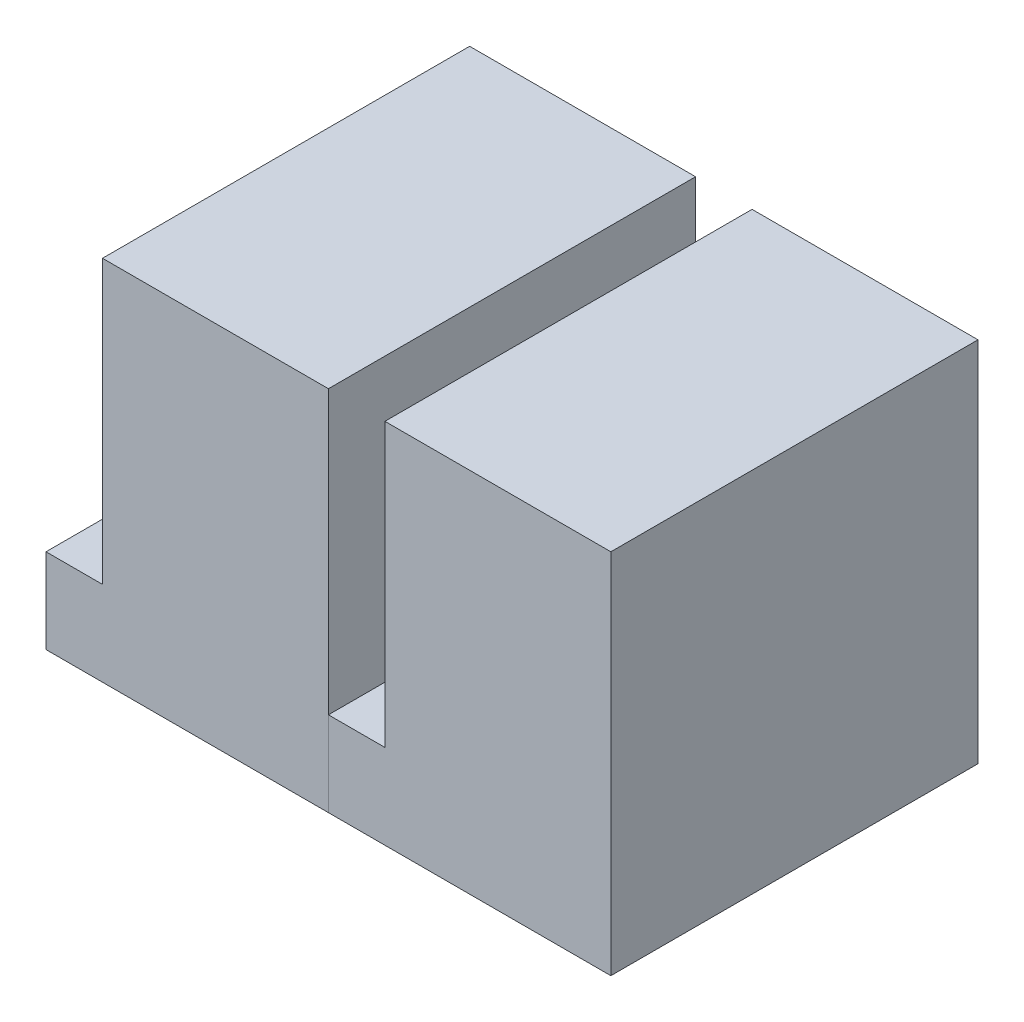
ISO-10303-21;
HEADER;
FILE_DESCRIPTION(('STEP AP214'),'2;1');
FILE_NAME('part.step','',(''),(''),'','','');
FILE_SCHEMA(('AUTOMOTIVE_DESIGN { 1 0 10303 214 1 1 1 1 }'));
ENDSEC;
DATA;
#1=APPLICATION_CONTEXT('core data for automotive mechanical design processes');
#2=APPLICATION_PROTOCOL_DEFINITION('international standard','automotive_design',2000,#1);
#3=PRODUCT_CONTEXT('',#1,'mechanical');
#4=PRODUCT('Part','Part','',(#3));
#5=PRODUCT_RELATED_PRODUCT_CATEGORY('part','',(#4));
#6=PRODUCT_DEFINITION_FORMATION('','',#4);
#7=PRODUCT_DEFINITION_CONTEXT('part definition',#1,'design');
#8=PRODUCT_DEFINITION('design','',#6,#7);
#9=PRODUCT_DEFINITION_SHAPE('','',#8);
#10=(LENGTH_UNIT() NAMED_UNIT(*) SI_UNIT(.MILLI.,.METRE.));
#11=(NAMED_UNIT(*) PLANE_ANGLE_UNIT() SI_UNIT($,.RADIAN.));
#12=(NAMED_UNIT(*) SI_UNIT($,.STERADIAN.) SOLID_ANGLE_UNIT());
#13=UNCERTAINTY_MEASURE_WITH_UNIT(LENGTH_MEASURE(1.E-05),#10,'distance_accuracy_value','');
#14=(GEOMETRIC_REPRESENTATION_CONTEXT(3) GLOBAL_UNCERTAINTY_ASSIGNED_CONTEXT((#13)) GLOBAL_UNIT_ASSIGNED_CONTEXT((#10,
#11,#12)) REPRESENTATION_CONTEXT('',''));
#15=CARTESIAN_POINT('',(0.,0.,0.));
#16=DIRECTION('',(0.,0.,1.));
#17=DIRECTION('',(1.,0.,0.));
#18=AXIS2_PLACEMENT_3D('',#15,#16,#17);
#19=CARTESIAN_POINT('',(-10.,13.,0.));
#20=DIRECTION('',(1.,0.,0.));
#21=DIRECTION('',(0.,0.,-1.));
#22=AXIS2_PLACEMENT_3D('',#19,#20,#21);
#23=PLANE('',#22);
#24=DIRECTION('',(0.,0.,-1.));
#25=VECTOR('',#24,1.);
#26=CARTESIAN_POINT('',(-10.,3.,-13.));
#27=LINE('',#26,#25);
#28=CARTESIAN_POINT('',(-10.,3.,0.));
#29=VERTEX_POINT('',#28);
#30=CARTESIAN_POINT('',(-10.,3.,-13.));
#31=VERTEX_POINT('',#30);
#32=EDGE_CURVE('E65',#29,#31,#27,.T.);
#33=ORIENTED_EDGE('',*,*,#32,.F.);
#34=DIRECTION('',(0.,-1.,0.));
#35=VECTOR('',#34,1.);
#36=CARTESIAN_POINT('',(-10.,13.,0.));
#37=LINE('',#36,#35);
#38=CARTESIAN_POINT('',(-10.,13.,0.));
#39=VERTEX_POINT('',#38);
#40=EDGE_CURVE('E12',#39,#29,#37,.T.);
#41=ORIENTED_EDGE('',*,*,#40,.F.);
#42=DIRECTION('',(0.,0.,1.));
#43=VECTOR('',#42,1.);
#44=CARTESIAN_POINT('',(-10.,13.,0.));
#45=LINE('',#44,#43);
#46=CARTESIAN_POINT('',(-10.,13.,-13.));
#47=VERTEX_POINT('',#46);
#48=EDGE_CURVE('E139',#47,#39,#45,.T.);
#49=ORIENTED_EDGE('',*,*,#48,.F.);
#50=DIRECTION('',(0.,-1.,0.));
#51=VECTOR('',#50,1.);
#52=CARTESIAN_POINT('',(-10.,13.,-13.));
#53=LINE('',#52,#51);
#54=EDGE_CURVE('E202',#47,#31,#53,.T.);
#55=ORIENTED_EDGE('',*,*,#54,.T.);
#56=EDGE_LOOP('',(#33,#41,#49,#55));
#57=FACE_BOUND('',#56,.T.);
#58=ADVANCED_FACE('F51',(#57),#23,.F.);
#59=CARTESIAN_POINT('',(-10.,13.,0.));
#60=DIRECTION('',(0.,0.,-1.));
#61=DIRECTION('',(-1.,0.,0.));
#62=AXIS2_PLACEMENT_3D('',#59,#60,#61);
#63=PLANE('',#62);
#64=DIRECTION('',(1.,0.,0.));
#65=VECTOR('',#64,1.);
#66=CARTESIAN_POINT('',(-10.,0.,0.));
#67=LINE('',#66,#65);
#68=CARTESIAN_POINT('',(-12.,0.,0.));
#69=VERTEX_POINT('',#68);
#70=CARTESIAN_POINT('',(-2.,0.,0.));
#71=VERTEX_POINT('',#70);
#72=EDGE_CURVE('E145',#69,#71,#67,.T.);
#73=ORIENTED_EDGE('',*,*,#72,.T.);
#74=DIRECTION('',(0.,-1.,0.));
#75=VECTOR('',#74,1.);
#76=CARTESIAN_POINT('',(-2.,13.,0.));
#77=LINE('',#76,#75);
#78=CARTESIAN_POINT('',(-2.,13.,0.));
#79=VERTEX_POINT('',#78);
#80=EDGE_CURVE('E58',#79,#71,#77,.T.);
#81=ORIENTED_EDGE('',*,*,#80,.F.);
#82=DIRECTION('',(1.,0.,0.));
#83=VECTOR('',#82,1.);
#84=CARTESIAN_POINT('',(-10.,13.,0.));
#85=LINE('',#84,#83);
#86=EDGE_CURVE('E196',#39,#79,#85,.T.);
#87=ORIENTED_EDGE('',*,*,#86,.F.);
#88=ORIENTED_EDGE('',*,*,#40,.T.);
#89=DIRECTION('',(1.,0.,0.));
#90=VECTOR('',#89,1.);
#91=CARTESIAN_POINT('',(-12.,3.,0.));
#92=LINE('',#91,#90);
#93=CARTESIAN_POINT('',(-12.,3.,0.));
#94=VERTEX_POINT('',#93);
#95=EDGE_CURVE('E161',#94,#29,#92,.T.);
#96=ORIENTED_EDGE('',*,*,#95,.F.);
#97=DIRECTION('',(0.,1.,0.));
#98=VECTOR('',#97,1.);
#99=CARTESIAN_POINT('',(-12.,0.,0.));
#100=LINE('',#99,#98);
#101=EDGE_CURVE('E148',#69,#94,#100,.T.);
#102=ORIENTED_EDGE('',*,*,#101,.F.);
#103=EDGE_LOOP('',(#73,#81,#87,#88,#96,#102));
#104=FACE_BOUND('',#103,.T.);
#105=ADVANCED_FACE('F212',(#104),#63,.F.);
#106=CARTESIAN_POINT('',(-2.,13.,0.));
#107=DIRECTION('',(-1.,0.,0.));
#108=DIRECTION('',(0.,0.,1.));
#109=AXIS2_PLACEMENT_3D('',#106,#107,#108);
#110=PLANE('',#109);
#111=DIRECTION('',(0.,0.,-1.));
#112=VECTOR('',#111,1.);
#113=CARTESIAN_POINT('',(-2.,0.,0.));
#114=LINE('',#113,#112);
#115=CARTESIAN_POINT('',(-2.,0.,-13.));
#116=VERTEX_POINT('',#115);
#117=EDGE_CURVE('E140',#71,#116,#114,.T.);
#118=ORIENTED_EDGE('',*,*,#117,.T.);
#119=DIRECTION('',(0.,-1.,0.));
#120=VECTOR('',#119,1.);
#121=CARTESIAN_POINT('',(-2.,13.,-13.));
#122=LINE('',#121,#120);
#123=CARTESIAN_POINT('',(-2.,13.,-13.));
#124=VERTEX_POINT('',#123);
#125=EDGE_CURVE('E136',#124,#116,#122,.T.);
#126=ORIENTED_EDGE('',*,*,#125,.F.);
#127=DIRECTION('',(0.,0.,-1.));
#128=VECTOR('',#127,1.);
#129=CARTESIAN_POINT('',(-2.,13.,0.));
#130=LINE('',#129,#128);
#131=EDGE_CURVE('E198',#79,#124,#130,.T.);
#132=ORIENTED_EDGE('',*,*,#131,.F.);
#133=ORIENTED_EDGE('',*,*,#80,.T.);
#134=EDGE_LOOP('',(#118,#126,#132,#133));
#135=FACE_BOUND('',#134,.T.);
#136=ADVANCED_FACE('F210',(#135),#110,.F.);
#137=CARTESIAN_POINT('',(-10.,13.,-13.));
#138=DIRECTION('',(0.,0.,1.));
#139=DIRECTION('',(1.,0.,0.));
#140=AXIS2_PLACEMENT_3D('',#137,#138,#139);
#141=PLANE('',#140);
#142=DIRECTION('',(-1.,0.,0.));
#143=VECTOR('',#142,1.);
#144=CARTESIAN_POINT('',(-10.,0.,-13.));
#145=LINE('',#144,#143);
#146=CARTESIAN_POINT('',(-12.,0.,-13.));
#147=VERTEX_POINT('',#146);
#148=EDGE_CURVE('E128',#116,#147,#145,.T.);
#149=ORIENTED_EDGE('',*,*,#148,.T.);
#150=DIRECTION('',(0.,-1.,0.));
#151=VECTOR('',#150,1.);
#152=CARTESIAN_POINT('',(-12.,0.,-13.));
#153=LINE('',#152,#151);
#154=CARTESIAN_POINT('',(-12.,3.,-13.));
#155=VERTEX_POINT('',#154);
#156=EDGE_CURVE('E133',#155,#147,#153,.T.);
#157=ORIENTED_EDGE('',*,*,#156,.F.);
#158=DIRECTION('',(1.,0.,0.));
#159=VECTOR('',#158,1.);
#160=CARTESIAN_POINT('',(-12.,3.,-13.));
#161=LINE('',#160,#159);
#162=EDGE_CURVE('E158',#155,#31,#161,.T.);
#163=ORIENTED_EDGE('',*,*,#162,.T.);
#164=ORIENTED_EDGE('',*,*,#54,.F.);
#165=DIRECTION('',(-1.,0.,0.));
#166=VECTOR('',#165,1.);
#167=CARTESIAN_POINT('',(-10.,13.,-13.));
#168=LINE('',#167,#166);
#169=EDGE_CURVE('E200',#124,#47,#168,.T.);
#170=ORIENTED_EDGE('',*,*,#169,.F.);
#171=ORIENTED_EDGE('',*,*,#125,.T.);
#172=EDGE_LOOP('',(#149,#157,#163,#164,#170,#171));
#173=FACE_BOUND('',#172,.T.);
#174=ADVANCED_FACE('F130',(#173),#141,.F.);
#175=CARTESIAN_POINT('',(-10.,13.,0.));
#176=DIRECTION('',(0.,-1.,0.));
#177=DIRECTION('',(0.,0.,-1.));
#178=AXIS2_PLACEMENT_3D('',#175,#176,#177);
#179=PLANE('',#178);
#180=ORIENTED_EDGE('',*,*,#48,.T.);
#181=ORIENTED_EDGE('',*,*,#86,.T.);
#182=ORIENTED_EDGE('',*,*,#131,.T.);
#183=ORIENTED_EDGE('',*,*,#169,.T.);
#184=EDGE_LOOP('',(#180,#181,#182,#183));
#185=FACE_BOUND('',#184,.T.);
#186=ADVANCED_FACE('F219',(#185),#179,.F.);
#187=CARTESIAN_POINT('',(-10.,0.,0.));
#188=DIRECTION('',(0.,-1.,0.));
#189=DIRECTION('',(0.,0.,-1.));
#190=AXIS2_PLACEMENT_3D('',#187,#188,#189);
#191=PLANE('',#190);
#192=DIRECTION('',(0.,0.,-1.));
#193=VECTOR('',#192,1.);
#194=CARTESIAN_POINT('',(-9.,0.,-1.));
#195=LINE('',#194,#193);
#196=CARTESIAN_POINT('',(-9.,0.,-1.));
#197=VERTEX_POINT('',#196);
#198=CARTESIAN_POINT('',(-9.,0.,-12.));
#199=VERTEX_POINT('',#198);
#200=EDGE_CURVE('E72',#197,#199,#195,.T.);
#201=ORIENTED_EDGE('',*,*,#200,.F.);
#202=DIRECTION('',(-1.,0.,0.));
#203=VECTOR('',#202,1.);
#204=CARTESIAN_POINT('',(-9.,0.,-1.));
#205=LINE('',#204,#203);
#206=CARTESIAN_POINT('',(-3.,0.,-1.));
#207=VERTEX_POINT('',#206);
#208=EDGE_CURVE('E168',#207,#197,#205,.T.);
#209=ORIENTED_EDGE('',*,*,#208,.F.);
#210=DIRECTION('',(0.,0.,1.));
#211=VECTOR('',#210,1.);
#212=CARTESIAN_POINT('',(-3.,0.,-1.));
#213=LINE('',#212,#211);
#214=CARTESIAN_POINT('',(-3.,0.,-12.));
#215=VERTEX_POINT('',#214);
#216=EDGE_CURVE('E182',#215,#207,#213,.T.);
#217=ORIENTED_EDGE('',*,*,#216,.F.);
#218=DIRECTION('',(1.,0.,0.));
#219=VECTOR('',#218,1.);
#220=CARTESIAN_POINT('',(-9.,0.,-12.));
#221=LINE('',#220,#219);
#222=EDGE_CURVE('E179',#199,#215,#221,.T.);
#223=ORIENTED_EDGE('',*,*,#222,.F.);
#224=EDGE_LOOP('',(#201,#209,#217,#223));
#225=FACE_BOUND('',#224,.T.);
#226=ORIENTED_EDGE('',*,*,#72,.F.);
#227=DIRECTION('',(0.,0.,1.));
#228=VECTOR('',#227,1.);
#229=CARTESIAN_POINT('',(-12.,0.,-13.));
#230=LINE('',#229,#228);
#231=EDGE_CURVE('E143',#147,#69,#230,.T.);
#232=ORIENTED_EDGE('',*,*,#231,.F.);
#233=ORIENTED_EDGE('',*,*,#148,.F.);
#234=ORIENTED_EDGE('',*,*,#117,.F.);
#235=EDGE_LOOP('',(#226,#232,#233,#234));
#236=FACE_BOUND('',#235,.T.);
#237=ADVANCED_FACE('F144',(#225,#236),#191,.T.);
#238=CARTESIAN_POINT('',(-9.,12.,-1.));
#239=DIRECTION('',(-1.,0.,0.));
#240=DIRECTION('',(0.,0.,1.));
#241=AXIS2_PLACEMENT_3D('',#238,#239,#240);
#242=PLANE('',#241);
#243=ORIENTED_EDGE('',*,*,#200,.T.);
#244=DIRECTION('',(0.,-1.,0.));
#245=VECTOR('',#244,1.);
#246=CARTESIAN_POINT('',(-9.,12.,-12.));
#247=LINE('',#246,#245);
#248=CARTESIAN_POINT('',(-9.,12.,-12.));
#249=VERTEX_POINT('',#248);
#250=EDGE_CURVE('E177',#249,#199,#247,.T.);
#251=ORIENTED_EDGE('',*,*,#250,.F.);
#252=DIRECTION('',(0.,0.,-1.));
#253=VECTOR('',#252,1.);
#254=CARTESIAN_POINT('',(-9.,12.,-1.));
#255=LINE('',#254,#253);
#256=CARTESIAN_POINT('',(-9.,12.,-1.));
#257=VERTEX_POINT('',#256);
#258=EDGE_CURVE('E164',#257,#249,#255,.T.);
#259=ORIENTED_EDGE('',*,*,#258,.F.);
#260=DIRECTION('',(0.,-1.,0.));
#261=VECTOR('',#260,1.);
#262=CARTESIAN_POINT('',(-9.,12.,-1.));
#263=LINE('',#262,#261);
#264=EDGE_CURVE('E187',#257,#197,#263,.T.);
#265=ORIENTED_EDGE('',*,*,#264,.T.);
#266=EDGE_LOOP('',(#243,#251,#259,#265));
#267=FACE_BOUND('',#266,.T.);
#268=ADVANCED_FACE('F226',(#267),#242,.F.);
#269=CARTESIAN_POINT('',(-9.,12.,-1.));
#270=DIRECTION('',(0.,0.,1.));
#271=DIRECTION('',(1.,0.,0.));
#272=AXIS2_PLACEMENT_3D('',#269,#270,#271);
#273=PLANE('',#272);
#274=ORIENTED_EDGE('',*,*,#208,.T.);
#275=ORIENTED_EDGE('',*,*,#264,.F.);
#276=DIRECTION('',(-1.,0.,0.));
#277=VECTOR('',#276,1.);
#278=CARTESIAN_POINT('',(-9.,12.,-1.));
#279=LINE('',#278,#277);
#280=CARTESIAN_POINT('',(-3.,12.,-1.));
#281=VERTEX_POINT('',#280);
#282=EDGE_CURVE('E174',#281,#257,#279,.T.);
#283=ORIENTED_EDGE('',*,*,#282,.F.);
#284=DIRECTION('',(0.,-1.,0.));
#285=VECTOR('',#284,1.);
#286=CARTESIAN_POINT('',(-3.,12.,-1.));
#287=LINE('',#286,#285);
#288=EDGE_CURVE('E189',#281,#207,#287,.T.);
#289=ORIENTED_EDGE('',*,*,#288,.T.);
#290=EDGE_LOOP('',(#274,#275,#283,#289));
#291=FACE_BOUND('',#290,.T.);
#292=ADVANCED_FACE('F266',(#291),#273,.F.);
#293=CARTESIAN_POINT('',(-3.,12.,-1.));
#294=DIRECTION('',(1.,0.,0.));
#295=DIRECTION('',(0.,0.,-1.));
#296=AXIS2_PLACEMENT_3D('',#293,#294,#295);
#297=PLANE('',#296);
#298=ORIENTED_EDGE('',*,*,#216,.T.);
#299=ORIENTED_EDGE('',*,*,#288,.F.);
#300=DIRECTION('',(0.,0.,1.));
#301=VECTOR('',#300,1.);
#302=CARTESIAN_POINT('',(-3.,12.,-1.));
#303=LINE('',#302,#301);
#304=CARTESIAN_POINT('',(-3.,12.,-12.));
#305=VERTEX_POINT('',#304);
#306=EDGE_CURVE('E171',#305,#281,#303,.T.);
#307=ORIENTED_EDGE('',*,*,#306,.F.);
#308=DIRECTION('',(0.,-1.,0.));
#309=VECTOR('',#308,1.);
#310=CARTESIAN_POINT('',(-3.,12.,-12.));
#311=LINE('',#310,#309);
#312=EDGE_CURVE('E191',#305,#215,#311,.T.);
#313=ORIENTED_EDGE('',*,*,#312,.T.);
#314=EDGE_LOOP('',(#298,#299,#307,#313));
#315=FACE_BOUND('',#314,.T.);
#316=ADVANCED_FACE('F274',(#315),#297,.F.);
#317=CARTESIAN_POINT('',(-9.,12.,-12.));
#318=DIRECTION('',(0.,0.,-1.));
#319=DIRECTION('',(-1.,0.,0.));
#320=AXIS2_PLACEMENT_3D('',#317,#318,#319);
#321=PLANE('',#320);
#322=ORIENTED_EDGE('',*,*,#222,.T.);
#323=ORIENTED_EDGE('',*,*,#312,.F.);
#324=DIRECTION('',(1.,0.,0.));
#325=VECTOR('',#324,1.);
#326=CARTESIAN_POINT('',(-9.,12.,-12.));
#327=LINE('',#326,#325);
#328=EDGE_CURVE('E167',#249,#305,#327,.T.);
#329=ORIENTED_EDGE('',*,*,#328,.F.);
#330=ORIENTED_EDGE('',*,*,#250,.T.);
#331=EDGE_LOOP('',(#322,#323,#329,#330));
#332=FACE_BOUND('',#331,.T.);
#333=ADVANCED_FACE('F284',(#332),#321,.F.);
#334=CARTESIAN_POINT('',(-10.,12.,0.));
#335=DIRECTION('',(0.,-1.,0.));
#336=DIRECTION('',(0.,0.,-1.));
#337=AXIS2_PLACEMENT_3D('',#334,#335,#336);
#338=PLANE('',#337);
#339=ORIENTED_EDGE('',*,*,#258,.T.);
#340=ORIENTED_EDGE('',*,*,#328,.T.);
#341=ORIENTED_EDGE('',*,*,#306,.T.);
#342=ORIENTED_EDGE('',*,*,#282,.T.);
#343=EDGE_LOOP('',(#339,#340,#341,#342));
#344=FACE_BOUND('',#343,.T.);
#345=ADVANCED_FACE('F294',(#344),#338,.T.);
#346=CARTESIAN_POINT('',(-12.,3.,-13.));
#347=DIRECTION('',(0.,-1.,0.));
#348=DIRECTION('',(0.,0.,-1.));
#349=AXIS2_PLACEMENT_3D('',#346,#347,#348);
#350=PLANE('',#349);
#351=ORIENTED_EDGE('',*,*,#32,.T.);
#352=ORIENTED_EDGE('',*,*,#162,.F.);
#353=DIRECTION('',(0.,0.,-1.));
#354=VECTOR('',#353,1.);
#355=CARTESIAN_POINT('',(-12.,3.,-13.));
#356=LINE('',#355,#354);
#357=EDGE_CURVE('E152',#94,#155,#356,.T.);
#358=ORIENTED_EDGE('',*,*,#357,.F.);
#359=ORIENTED_EDGE('',*,*,#95,.T.);
#360=EDGE_LOOP('',(#351,#352,#358,#359));
#361=FACE_BOUND('',#360,.T.);
#362=ADVANCED_FACE('F215',(#361),#350,.F.);
#363=CARTESIAN_POINT('',(-12.,0.,0.));
#364=DIRECTION('',(1.,0.,0.));
#365=DIRECTION('',(0.,0.,-1.));
#366=AXIS2_PLACEMENT_3D('',#363,#364,#365);
#367=PLANE('',#366);
#368=ORIENTED_EDGE('',*,*,#156,.T.);
#369=ORIENTED_EDGE('',*,*,#231,.T.);
#370=ORIENTED_EDGE('',*,*,#101,.T.);
#371=ORIENTED_EDGE('',*,*,#357,.T.);
#372=EDGE_LOOP('',(#368,#369,#370,#371));
#373=FACE_BOUND('',#372,.T.);
#374=ADVANCED_FACE('F150',(#373),#367,.F.);
#375=CLOSED_SHELL('',(#58,#105,#136,#174,#186,#237,#268,#292,#316,#333,#345,#362,#374));
#376=MANIFOLD_SOLID_BREP('B2',#375);
#377=CARTESIAN_POINT('',(0.,13.,0.));
#378=DIRECTION('',(1.,0.,0.));
#379=DIRECTION('',(0.,0.,-1.));
#380=AXIS2_PLACEMENT_3D('',#377,#378,#379);
#381=PLANE('',#380);
#382=DIRECTION('',(0.,0.,-1.));
#383=VECTOR('',#382,1.);
#384=CARTESIAN_POINT('',(0.,3.,-13.));
#385=LINE('',#384,#383);
#386=CARTESIAN_POINT('',(0.,3.,0.));
#387=VERTEX_POINT('',#386);
#388=CARTESIAN_POINT('',(0.,3.,-13.));
#389=VERTEX_POINT('',#388);
#390=EDGE_CURVE('E365',#387,#389,#385,.T.);
#391=ORIENTED_EDGE('',*,*,#390,.F.);
#392=DIRECTION('',(0.,-1.,0.));
#393=VECTOR('',#392,1.);
#394=CARTESIAN_POINT('',(0.,13.,0.));
#395=LINE('',#394,#393);
#396=CARTESIAN_POINT('',(0.,13.,0.));
#397=VERTEX_POINT('',#396);
#398=EDGE_CURVE('E49',#397,#387,#395,.T.);
#399=ORIENTED_EDGE('',*,*,#398,.F.);
#400=DIRECTION('',(0.,0.,1.));
#401=VECTOR('',#400,1.);
#402=CARTESIAN_POINT('',(0.,13.,0.));
#403=LINE('',#402,#401);
#404=CARTESIAN_POINT('',(0.,13.,-13.));
#405=VERTEX_POINT('',#404);
#406=EDGE_CURVE('E439',#405,#397,#403,.T.);
#407=ORIENTED_EDGE('',*,*,#406,.F.);
#408=DIRECTION('',(0.,-1.,0.));
#409=VECTOR('',#408,1.);
#410=CARTESIAN_POINT('',(0.,13.,-13.));
#411=LINE('',#410,#409);
#412=EDGE_CURVE('E502',#405,#389,#411,.T.);
#413=ORIENTED_EDGE('',*,*,#412,.T.);
#414=EDGE_LOOP('',(#391,#399,#407,#413));
#415=FACE_BOUND('',#414,.T.);
#416=ADVANCED_FACE('F351',(#415),#381,.F.);
#417=CARTESIAN_POINT('',(0.,13.,0.));
#418=DIRECTION('',(0.,0.,-1.));
#419=DIRECTION('',(-1.,0.,0.));
#420=AXIS2_PLACEMENT_3D('',#417,#418,#419);
#421=PLANE('',#420);
#422=DIRECTION('',(1.,0.,0.));
#423=VECTOR('',#422,1.);
#424=CARTESIAN_POINT('',(0.,0.,0.));
#425=LINE('',#424,#423);
#426=CARTESIAN_POINT('',(-2.,0.,0.));
#427=VERTEX_POINT('',#426);
#428=CARTESIAN_POINT('',(8.,0.,0.));
#429=VERTEX_POINT('',#428);
#430=EDGE_CURVE('E445',#427,#429,#425,.T.);
#431=ORIENTED_EDGE('',*,*,#430,.T.);
#432=DIRECTION('',(0.,-1.,0.));
#433=VECTOR('',#432,1.);
#434=CARTESIAN_POINT('',(8.,13.,0.));
#435=LINE('',#434,#433);
#436=CARTESIAN_POINT('',(8.,13.,0.));
#437=VERTEX_POINT('',#436);
#438=EDGE_CURVE('E358',#437,#429,#435,.T.);
#439=ORIENTED_EDGE('',*,*,#438,.F.);
#440=DIRECTION('',(1.,0.,0.));
#441=VECTOR('',#440,1.);
#442=CARTESIAN_POINT('',(0.,13.,0.));
#443=LINE('',#442,#441);
#444=EDGE_CURVE('E496',#397,#437,#443,.T.);
#445=ORIENTED_EDGE('',*,*,#444,.F.);
#446=ORIENTED_EDGE('',*,*,#398,.T.);
#447=DIRECTION('',(1.,0.,0.));
#448=VECTOR('',#447,1.);
#449=CARTESIAN_POINT('',(-2.,3.,0.));
#450=LINE('',#449,#448);
#451=CARTESIAN_POINT('',(-2.,3.,0.));
#452=VERTEX_POINT('',#451);
#453=EDGE_CURVE('E461',#452,#387,#450,.T.);
#454=ORIENTED_EDGE('',*,*,#453,.F.);
#455=DIRECTION('',(0.,1.,0.));
#456=VECTOR('',#455,1.);
#457=CARTESIAN_POINT('',(-2.,0.,0.));
#458=LINE('',#457,#456);
#459=EDGE_CURVE('E448',#427,#452,#458,.T.);
#460=ORIENTED_EDGE('',*,*,#459,.F.);
#461=EDGE_LOOP('',(#431,#439,#445,#446,#454,#460));
#462=FACE_BOUND('',#461,.T.);
#463=ADVANCED_FACE('F512',(#462),#421,.F.);
#464=CARTESIAN_POINT('',(8.,13.,0.));
#465=DIRECTION('',(-1.,0.,0.));
#466=DIRECTION('',(0.,0.,1.));
#467=AXIS2_PLACEMENT_3D('',#464,#465,#466);
#468=PLANE('',#467);
#469=DIRECTION('',(0.,0.,-1.));
#470=VECTOR('',#469,1.);
#471=CARTESIAN_POINT('',(8.,0.,0.));
#472=LINE('',#471,#470);
#473=CARTESIAN_POINT('',(8.,0.,-13.));
#474=VERTEX_POINT('',#473);
#475=EDGE_CURVE('E440',#429,#474,#472,.T.);
#476=ORIENTED_EDGE('',*,*,#475,.T.);
#477=DIRECTION('',(0.,-1.,0.));
#478=VECTOR('',#477,1.);
#479=CARTESIAN_POINT('',(8.,13.,-13.));
#480=LINE('',#479,#478);
#481=CARTESIAN_POINT('',(8.,13.,-13.));
#482=VERTEX_POINT('',#481);
#483=EDGE_CURVE('E436',#482,#474,#480,.T.);
#484=ORIENTED_EDGE('',*,*,#483,.F.);
#485=DIRECTION('',(0.,0.,-1.));
#486=VECTOR('',#485,1.);
#487=CARTESIAN_POINT('',(8.,13.,0.));
#488=LINE('',#487,#486);
#489=EDGE_CURVE('E498',#437,#482,#488,.T.);
#490=ORIENTED_EDGE('',*,*,#489,.F.);
#491=ORIENTED_EDGE('',*,*,#438,.T.);
#492=EDGE_LOOP('',(#476,#484,#490,#491));
#493=FACE_BOUND('',#492,.T.);
#494=ADVANCED_FACE('F510',(#493),#468,.F.);
#495=CARTESIAN_POINT('',(0.,13.,-13.));
#496=DIRECTION('',(0.,0.,1.));
#497=DIRECTION('',(1.,0.,0.));
#498=AXIS2_PLACEMENT_3D('',#495,#496,#497);
#499=PLANE('',#498);
#500=DIRECTION('',(-1.,0.,0.));
#501=VECTOR('',#500,1.);
#502=CARTESIAN_POINT('',(0.,0.,-13.));
#503=LINE('',#502,#501);
#504=CARTESIAN_POINT('',(-2.,0.,-13.));
#505=VERTEX_POINT('',#504);
#506=EDGE_CURVE('E428',#474,#505,#503,.T.);
#507=ORIENTED_EDGE('',*,*,#506,.T.);
#508=DIRECTION('',(0.,-1.,0.));
#509=VECTOR('',#508,1.);
#510=CARTESIAN_POINT('',(-2.,0.,-13.));
#511=LINE('',#510,#509);
#512=CARTESIAN_POINT('',(-2.,3.,-13.));
#513=VERTEX_POINT('',#512);
#514=EDGE_CURVE('E433',#513,#505,#511,.T.);
#515=ORIENTED_EDGE('',*,*,#514,.F.);
#516=DIRECTION('',(1.,0.,0.));
#517=VECTOR('',#516,1.);
#518=CARTESIAN_POINT('',(-2.,3.,-13.));
#519=LINE('',#518,#517);
#520=EDGE_CURVE('E458',#513,#389,#519,.T.);
#521=ORIENTED_EDGE('',*,*,#520,.T.);
#522=ORIENTED_EDGE('',*,*,#412,.F.);
#523=DIRECTION('',(-1.,0.,0.));
#524=VECTOR('',#523,1.);
#525=CARTESIAN_POINT('',(0.,13.,-13.));
#526=LINE('',#525,#524);
#527=EDGE_CURVE('E500',#482,#405,#526,.T.);
#528=ORIENTED_EDGE('',*,*,#527,.F.);
#529=ORIENTED_EDGE('',*,*,#483,.T.);
#530=EDGE_LOOP('',(#507,#515,#521,#522,#528,#529));
#531=FACE_BOUND('',#530,.T.);
#532=ADVANCED_FACE('F430',(#531),#499,.F.);
#533=CARTESIAN_POINT('',(0.,13.,0.));
#534=DIRECTION('',(0.,-1.,0.));
#535=DIRECTION('',(0.,0.,-1.));
#536=AXIS2_PLACEMENT_3D('',#533,#534,#535);
#537=PLANE('',#536);
#538=ORIENTED_EDGE('',*,*,#406,.T.);
#539=ORIENTED_EDGE('',*,*,#444,.T.);
#540=ORIENTED_EDGE('',*,*,#489,.T.);
#541=ORIENTED_EDGE('',*,*,#527,.T.);
#542=EDGE_LOOP('',(#538,#539,#540,#541));
#543=FACE_BOUND('',#542,.T.);
#544=ADVANCED_FACE('F519',(#543),#537,.F.);
#545=CARTESIAN_POINT('',(0.,0.,0.));
#546=DIRECTION('',(0.,-1.,0.));
#547=DIRECTION('',(0.,0.,-1.));
#548=AXIS2_PLACEMENT_3D('',#545,#546,#547);
#549=PLANE('',#548);
#550=DIRECTION('',(0.,0.,-1.));
#551=VECTOR('',#550,1.);
#552=CARTESIAN_POINT('',(1.,0.,-1.));
#553=LINE('',#552,#551);
#554=CARTESIAN_POINT('',(1.,0.,-1.));
#555=VERTEX_POINT('',#554);
#556=CARTESIAN_POINT('',(1.,0.,-12.));
#557=VERTEX_POINT('',#556);
#558=EDGE_CURVE('E372',#555,#557,#553,.T.);
#559=ORIENTED_EDGE('',*,*,#558,.F.);
#560=DIRECTION('',(-1.,0.,0.));
#561=VECTOR('',#560,1.);
#562=CARTESIAN_POINT('',(1.,0.,-1.));
#563=LINE('',#562,#561);
#564=CARTESIAN_POINT('',(7.,0.,-1.));
#565=VERTEX_POINT('',#564);
#566=EDGE_CURVE('E468',#565,#555,#563,.T.);
#567=ORIENTED_EDGE('',*,*,#566,.F.);
#568=DIRECTION('',(0.,0.,1.));
#569=VECTOR('',#568,1.);
#570=CARTESIAN_POINT('',(7.,0.,-1.));
#571=LINE('',#570,#569);
#572=CARTESIAN_POINT('',(7.,0.,-12.));
#573=VERTEX_POINT('',#572);
#574=EDGE_CURVE('E482',#573,#565,#571,.T.);
#575=ORIENTED_EDGE('',*,*,#574,.F.);
#576=DIRECTION('',(1.,0.,0.));
#577=VECTOR('',#576,1.);
#578=CARTESIAN_POINT('',(1.,0.,-12.));
#579=LINE('',#578,#577);
#580=EDGE_CURVE('E479',#557,#573,#579,.T.);
#581=ORIENTED_EDGE('',*,*,#580,.F.);
#582=EDGE_LOOP('',(#559,#567,#575,#581));
#583=FACE_BOUND('',#582,.T.);
#584=ORIENTED_EDGE('',*,*,#430,.F.);
#585=DIRECTION('',(0.,0.,1.));
#586=VECTOR('',#585,1.);
#587=CARTESIAN_POINT('',(-2.,0.,-13.));
#588=LINE('',#587,#586);
#589=EDGE_CURVE('E443',#505,#427,#588,.T.);
#590=ORIENTED_EDGE('',*,*,#589,.F.);
#591=ORIENTED_EDGE('',*,*,#506,.F.);
#592=ORIENTED_EDGE('',*,*,#475,.F.);
#593=EDGE_LOOP('',(#584,#590,#591,#592));
#594=FACE_BOUND('',#593,.T.);
#595=ADVANCED_FACE('F444',(#583,#594),#549,.T.);
#596=CARTESIAN_POINT('',(1.,12.,-1.));
#597=DIRECTION('',(-1.,0.,0.));
#598=DIRECTION('',(0.,0.,1.));
#599=AXIS2_PLACEMENT_3D('',#596,#597,#598);
#600=PLANE('',#599);
#601=ORIENTED_EDGE('',*,*,#558,.T.);
#602=DIRECTION('',(0.,-1.,0.));
#603=VECTOR('',#602,1.);
#604=CARTESIAN_POINT('',(1.,12.,-12.));
#605=LINE('',#604,#603);
#606=CARTESIAN_POINT('',(1.,12.,-12.));
#607=VERTEX_POINT('',#606);
#608=EDGE_CURVE('E477',#607,#557,#605,.T.);
#609=ORIENTED_EDGE('',*,*,#608,.F.);
#610=DIRECTION('',(0.,0.,-1.));
#611=VECTOR('',#610,1.);
#612=CARTESIAN_POINT('',(1.,12.,-1.));
#613=LINE('',#612,#611);
#614=CARTESIAN_POINT('',(1.,12.,-1.));
#615=VERTEX_POINT('',#614);
#616=EDGE_CURVE('E464',#615,#607,#613,.T.);
#617=ORIENTED_EDGE('',*,*,#616,.F.);
#618=DIRECTION('',(0.,-1.,0.));
#619=VECTOR('',#618,1.);
#620=CARTESIAN_POINT('',(1.,12.,-1.));
#621=LINE('',#620,#619);
#622=EDGE_CURVE('E487',#615,#555,#621,.T.);
#623=ORIENTED_EDGE('',*,*,#622,.T.);
#624=EDGE_LOOP('',(#601,#609,#617,#623));
#625=FACE_BOUND('',#624,.T.);
#626=ADVANCED_FACE('F526',(#625),#600,.F.);
#627=CARTESIAN_POINT('',(1.,12.,-1.));
#628=DIRECTION('',(0.,0.,1.));
#629=DIRECTION('',(1.,0.,0.));
#630=AXIS2_PLACEMENT_3D('',#627,#628,#629);
#631=PLANE('',#630);
#632=ORIENTED_EDGE('',*,*,#566,.T.);
#633=ORIENTED_EDGE('',*,*,#622,.F.);
#634=DIRECTION('',(-1.,0.,0.));
#635=VECTOR('',#634,1.);
#636=CARTESIAN_POINT('',(1.,12.,-1.));
#637=LINE('',#636,#635);
#638=CARTESIAN_POINT('',(7.,12.,-1.));
#639=VERTEX_POINT('',#638);
#640=EDGE_CURVE('E474',#639,#615,#637,.T.);
#641=ORIENTED_EDGE('',*,*,#640,.F.);
#642=DIRECTION('',(0.,-1.,0.));
#643=VECTOR('',#642,1.);
#644=CARTESIAN_POINT('',(7.,12.,-1.));
#645=LINE('',#644,#643);
#646=EDGE_CURVE('E489',#639,#565,#645,.T.);
#647=ORIENTED_EDGE('',*,*,#646,.T.);
#648=EDGE_LOOP('',(#632,#633,#641,#647));
#649=FACE_BOUND('',#648,.T.);
#650=ADVANCED_FACE('F582',(#649),#631,.F.);
#651=CARTESIAN_POINT('',(7.,12.,-1.));
#652=DIRECTION('',(1.,0.,0.));
#653=DIRECTION('',(0.,0.,-1.));
#654=AXIS2_PLACEMENT_3D('',#651,#652,#653);
#655=PLANE('',#654);
#656=ORIENTED_EDGE('',*,*,#574,.T.);
#657=ORIENTED_EDGE('',*,*,#646,.F.);
#658=DIRECTION('',(0.,0.,1.));
#659=VECTOR('',#658,1.);
#660=CARTESIAN_POINT('',(7.,12.,-1.));
#661=LINE('',#660,#659);
#662=CARTESIAN_POINT('',(7.,12.,-12.));
#663=VERTEX_POINT('',#662);
#664=EDGE_CURVE('E471',#663,#639,#661,.T.);
#665=ORIENTED_EDGE('',*,*,#664,.F.);
#666=DIRECTION('',(0.,-1.,0.));
#667=VECTOR('',#666,1.);
#668=CARTESIAN_POINT('',(7.,12.,-12.));
#669=LINE('',#668,#667);
#670=EDGE_CURVE('E491',#663,#573,#669,.T.);
#671=ORIENTED_EDGE('',*,*,#670,.T.);
#672=EDGE_LOOP('',(#656,#657,#665,#671));
#673=FACE_BOUND('',#672,.T.);
#674=ADVANCED_FACE('F585',(#673),#655,.F.);
#675=CARTESIAN_POINT('',(1.,12.,-12.));
#676=DIRECTION('',(0.,0.,-1.));
#677=DIRECTION('',(-1.,0.,0.));
#678=AXIS2_PLACEMENT_3D('',#675,#676,#677);
#679=PLANE('',#678);
#680=ORIENTED_EDGE('',*,*,#580,.T.);
#681=ORIENTED_EDGE('',*,*,#670,.F.);
#682=DIRECTION('',(1.,0.,0.));
#683=VECTOR('',#682,1.);
#684=CARTESIAN_POINT('',(1.,12.,-12.));
#685=LINE('',#684,#683);
#686=EDGE_CURVE('E467',#607,#663,#685,.T.);
#687=ORIENTED_EDGE('',*,*,#686,.F.);
#688=ORIENTED_EDGE('',*,*,#608,.T.);
#689=EDGE_LOOP('',(#680,#681,#687,#688));
#690=FACE_BOUND('',#689,.T.);
#691=ADVANCED_FACE('F580',(#690),#679,.F.);
#692=CARTESIAN_POINT('',(0.,12.,0.));
#693=DIRECTION('',(0.,-1.,0.));
#694=DIRECTION('',(0.,0.,-1.));
#695=AXIS2_PLACEMENT_3D('',#692,#693,#694);
#696=PLANE('',#695);
#697=ORIENTED_EDGE('',*,*,#616,.T.);
#698=ORIENTED_EDGE('',*,*,#686,.T.);
#699=ORIENTED_EDGE('',*,*,#664,.T.);
#700=ORIENTED_EDGE('',*,*,#640,.T.);
#701=EDGE_LOOP('',(#697,#698,#699,#700));
#702=FACE_BOUND('',#701,.T.);
#703=ADVANCED_FACE('F565',(#702),#696,.T.);
#704=CARTESIAN_POINT('',(-2.,3.,-13.));
#705=DIRECTION('',(0.,-1.,0.));
#706=DIRECTION('',(0.,0.,-1.));
#707=AXIS2_PLACEMENT_3D('',#704,#705,#706);
#708=PLANE('',#707);
#709=ORIENTED_EDGE('',*,*,#390,.T.);
#710=ORIENTED_EDGE('',*,*,#520,.F.);
#711=DIRECTION('',(0.,0.,-1.));
#712=VECTOR('',#711,1.);
#713=CARTESIAN_POINT('',(-2.,3.,-13.));
#714=LINE('',#713,#712);
#715=EDGE_CURVE('E452',#452,#513,#714,.T.);
#716=ORIENTED_EDGE('',*,*,#715,.F.);
#717=ORIENTED_EDGE('',*,*,#453,.T.);
#718=EDGE_LOOP('',(#709,#710,#716,#717));
#719=FACE_BOUND('',#718,.T.);
#720=ADVANCED_FACE('F515',(#719),#708,.F.);
#721=CARTESIAN_POINT('',(-2.,0.,0.));
#722=DIRECTION('',(1.,0.,0.));
#723=DIRECTION('',(0.,0.,-1.));
#724=AXIS2_PLACEMENT_3D('',#721,#722,#723);
#725=PLANE('',#724);
#726=ORIENTED_EDGE('',*,*,#514,.T.);
#727=ORIENTED_EDGE('',*,*,#589,.T.);
#728=ORIENTED_EDGE('',*,*,#459,.T.);
#729=ORIENTED_EDGE('',*,*,#715,.T.);
#730=EDGE_LOOP('',(#726,#727,#728,#729));
#731=FACE_BOUND('',#730,.T.);
#732=ADVANCED_FACE('F450',(#731),#725,.F.);
#733=CLOSED_SHELL('',(#416,#463,#494,#532,#544,#595,#626,#650,#674,#691,#703,#720,#732));
#734=MANIFOLD_SOLID_BREP('B6',#733);
#735=ADVANCED_BREP_SHAPE_REPRESENTATION('',(#18,#376,#734),#14);
#736=SHAPE_DEFINITION_REPRESENTATION(#9,#735);
ENDSEC;
END-ISO-10303-21;
